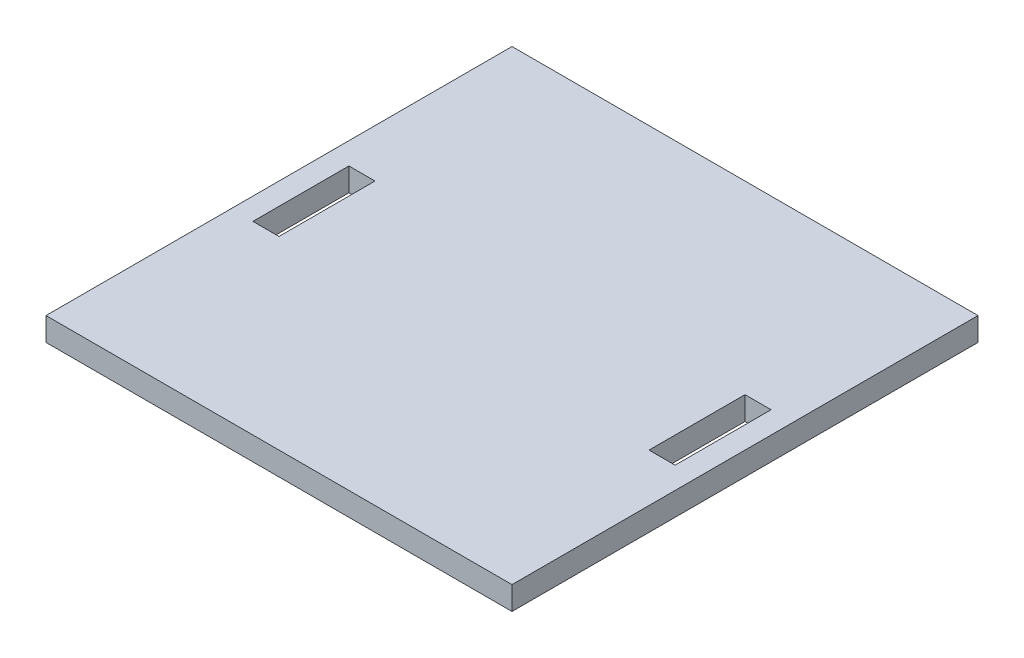
ISO-10303-21;
HEADER;
FILE_DESCRIPTION(('STEP AP214'),'2;1');
FILE_NAME('part.step','',(''),(''),'','','');
FILE_SCHEMA(('AUTOMOTIVE_DESIGN { 1 0 10303 214 1 1 1 1 }'));
ENDSEC;
DATA;
#1=APPLICATION_CONTEXT('core data for automotive mechanical design processes');
#2=APPLICATION_PROTOCOL_DEFINITION('international standard','automotive_design',2000,#1);
#3=PRODUCT_CONTEXT('',#1,'mechanical');
#4=PRODUCT('Part','Part','',(#3));
#5=PRODUCT_RELATED_PRODUCT_CATEGORY('part','',(#4));
#6=PRODUCT_DEFINITION_FORMATION('','',#4);
#7=PRODUCT_DEFINITION_CONTEXT('part definition',#1,'design');
#8=PRODUCT_DEFINITION('design','',#6,#7);
#9=PRODUCT_DEFINITION_SHAPE('','',#8);
#10=(LENGTH_UNIT() NAMED_UNIT(*) SI_UNIT(.MILLI.,.METRE.));
#11=(NAMED_UNIT(*) PLANE_ANGLE_UNIT() SI_UNIT($,.RADIAN.));
#12=(NAMED_UNIT(*) SI_UNIT($,.STERADIAN.) SOLID_ANGLE_UNIT());
#13=UNCERTAINTY_MEASURE_WITH_UNIT(LENGTH_MEASURE(1.E-05),#10,'distance_accuracy_value','');
#14=(GEOMETRIC_REPRESENTATION_CONTEXT(3) GLOBAL_UNCERTAINTY_ASSIGNED_CONTEXT((#13)) GLOBAL_UNIT_ASSIGNED_CONTEXT((#10,
#11,#12)) REPRESENTATION_CONTEXT('',''));
#15=CARTESIAN_POINT('',(0.,0.,0.));
#16=DIRECTION('',(0.,0.,1.));
#17=DIRECTION('',(1.,0.,0.));
#18=AXIS2_PLACEMENT_3D('',#15,#16,#17);
#19=CARTESIAN_POINT('',(0.,5.,0.));
#20=DIRECTION('',(0.,1.,0.));
#21=DIRECTION('',(0.,0.,1.));
#22=AXIS2_PLACEMENT_3D('',#19,#20,#21);
#23=PLANE('',#22);
#24=DIRECTION('',(0.,0.,1.));
#25=VECTOR('',#24,1.);
#26=CARTESIAN_POINT('',(0.,5.,0.));
#27=LINE('',#26,#25);
#28=CARTESIAN_POINT('',(0.,5.,0.));
#29=VERTEX_POINT('',#28);
#30=CARTESIAN_POINT('',(0.,5.,100.));
#31=VERTEX_POINT('',#30);
#32=EDGE_CURVE('E214',#29,#31,#27,.T.);
#33=ORIENTED_EDGE('',*,*,#32,.T.);
#34=DIRECTION('',(1.,0.,0.));
#35=VECTOR('',#34,1.);
#36=CARTESIAN_POINT('',(0.,5.,100.));
#37=LINE('',#36,#35);
#38=CARTESIAN_POINT('',(100.,5.,100.));
#39=VERTEX_POINT('',#38);
#40=EDGE_CURVE('E219',#31,#39,#37,.T.);
#41=ORIENTED_EDGE('',*,*,#40,.T.);
#42=DIRECTION('',(0.,0.,-1.));
#43=VECTOR('',#42,1.);
#44=CARTESIAN_POINT('',(100.,5.,0.));
#45=LINE('',#44,#43);
#46=CARTESIAN_POINT('',(100.,5.,0.));
#47=VERTEX_POINT('',#46);
#48=EDGE_CURVE('E227',#39,#47,#45,.T.);
#49=ORIENTED_EDGE('',*,*,#48,.T.);
#50=DIRECTION('',(-1.,0.,0.));
#51=VECTOR('',#50,1.);
#52=CARTESIAN_POINT('',(0.,5.,0.));
#53=LINE('',#52,#51);
#54=EDGE_CURVE('E230',#47,#29,#53,.T.);
#55=ORIENTED_EDGE('',*,*,#54,.T.);
#56=EDGE_LOOP('',(#33,#41,#49,#55));
#57=FACE_BOUND('',#56,.T.);
#58=DIRECTION('',(0.,0.,1.));
#59=VECTOR('',#58,1.);
#60=CARTESIAN_POINT('',(4.70000000000001,5.,39.7));
#61=LINE('',#60,#59);
#62=CARTESIAN_POINT('',(4.70000000000001,5.,39.7));
#63=VERTEX_POINT('',#62);
#64=CARTESIAN_POINT('',(4.70000000000001,5.,60.3));
#65=VERTEX_POINT('',#64);
#66=EDGE_CURVE('E180',#63,#65,#61,.T.);
#67=ORIENTED_EDGE('',*,*,#66,.F.);
#68=DIRECTION('',(-1.,0.,0.));
#69=VECTOR('',#68,1.);
#70=CARTESIAN_POINT('',(4.70000000000001,5.,39.7));
#71=LINE('',#70,#69);
#72=CARTESIAN_POINT('',(10.3,5.,39.7));
#73=VERTEX_POINT('',#72);
#74=EDGE_CURVE('E176',#73,#63,#71,.T.);
#75=ORIENTED_EDGE('',*,*,#74,.F.);
#76=DIRECTION('',(0.,0.,-1.));
#77=VECTOR('',#76,1.);
#78=CARTESIAN_POINT('',(10.3,5.,39.7));
#79=LINE('',#78,#77);
#80=CARTESIAN_POINT('',(10.3,5.,60.3));
#81=VERTEX_POINT('',#80);
#82=EDGE_CURVE('E187',#81,#73,#79,.T.);
#83=ORIENTED_EDGE('',*,*,#82,.F.);
#84=DIRECTION('',(1.,0.,0.));
#85=VECTOR('',#84,1.);
#86=CARTESIAN_POINT('',(4.70000000000001,5.,60.3));
#87=LINE('',#86,#85);
#88=EDGE_CURVE('E192',#65,#81,#87,.T.);
#89=ORIENTED_EDGE('',*,*,#88,.F.);
#90=EDGE_LOOP('',(#67,#75,#83,#89));
#91=FACE_BOUND('',#90,.T.);
#92=DIRECTION('',(0.,0.,1.));
#93=VECTOR('',#92,1.);
#94=CARTESIAN_POINT('',(89.7,5.,39.7));
#95=LINE('',#94,#93);
#96=CARTESIAN_POINT('',(89.7,5.,39.7));
#97=VERTEX_POINT('',#96);
#98=CARTESIAN_POINT('',(89.7,5.,60.3));
#99=VERTEX_POINT('',#98);
#100=EDGE_CURVE('E136',#97,#99,#95,.T.);
#101=ORIENTED_EDGE('',*,*,#100,.F.);
#102=DIRECTION('',(-1.,0.,0.));
#103=VECTOR('',#102,1.);
#104=CARTESIAN_POINT('',(95.3,5.,39.7));
#105=LINE('',#104,#103);
#106=CARTESIAN_POINT('',(95.3,5.,39.7));
#107=VERTEX_POINT('',#106);
#108=EDGE_CURVE('E127',#107,#97,#105,.T.);
#109=ORIENTED_EDGE('',*,*,#108,.F.);
#110=DIRECTION('',(0.,0.,-1.));
#111=VECTOR('',#110,1.);
#112=CARTESIAN_POINT('',(95.3,5.,39.7));
#113=LINE('',#112,#111);
#114=CARTESIAN_POINT('',(95.3,5.,60.3));
#115=VERTEX_POINT('',#114);
#116=EDGE_CURVE('E153',#115,#107,#113,.T.);
#117=ORIENTED_EDGE('',*,*,#116,.F.);
#118=DIRECTION('',(1.,0.,0.));
#119=VECTOR('',#118,1.);
#120=CARTESIAN_POINT('',(95.3,5.,60.3));
#121=LINE('',#120,#119);
#122=EDGE_CURVE('E148',#99,#115,#121,.T.);
#123=ORIENTED_EDGE('',*,*,#122,.F.);
#124=EDGE_LOOP('',(#101,#109,#117,#123));
#125=FACE_BOUND('',#124,.T.);
#126=ADVANCED_FACE('F38',(#57,#91,#125),#23,.T.);
#127=CARTESIAN_POINT('',(0.,0.,0.));
#128=DIRECTION('',(0.,1.,0.));
#129=DIRECTION('',(0.,0.,1.));
#130=AXIS2_PLACEMENT_3D('',#127,#128,#129);
#131=PLANE('',#130);
#132=DIRECTION('',(-1.,0.,0.));
#133=VECTOR('',#132,1.);
#134=CARTESIAN_POINT('',(4.70000000000001,0.,39.7));
#135=LINE('',#134,#133);
#136=CARTESIAN_POINT('',(10.3,0.,39.7));
#137=VERTEX_POINT('',#136);
#138=CARTESIAN_POINT('',(4.70000000000001,0.,39.7));
#139=VERTEX_POINT('',#138);
#140=EDGE_CURVE('E144',#137,#139,#135,.T.);
#141=ORIENTED_EDGE('',*,*,#140,.T.);
#142=DIRECTION('',(0.,0.,1.));
#143=VECTOR('',#142,1.);
#144=CARTESIAN_POINT('',(4.70000000000001,0.,39.7));
#145=LINE('',#144,#143);
#146=CARTESIAN_POINT('',(4.70000000000001,0.,60.3));
#147=VERTEX_POINT('',#146);
#148=EDGE_CURVE('E196',#139,#147,#145,.T.);
#149=ORIENTED_EDGE('',*,*,#148,.T.);
#150=DIRECTION('',(1.,0.,0.));
#151=VECTOR('',#150,1.);
#152=CARTESIAN_POINT('',(4.70000000000001,0.,60.3));
#153=LINE('',#152,#151);
#154=CARTESIAN_POINT('',(10.3,0.,60.3));
#155=VERTEX_POINT('',#154);
#156=EDGE_CURVE('E199',#147,#155,#153,.T.);
#157=ORIENTED_EDGE('',*,*,#156,.T.);
#158=DIRECTION('',(0.,0.,-1.));
#159=VECTOR('',#158,1.);
#160=CARTESIAN_POINT('',(10.3,0.,39.7));
#161=LINE('',#160,#159);
#162=EDGE_CURVE('E181',#155,#137,#161,.T.);
#163=ORIENTED_EDGE('',*,*,#162,.T.);
#164=EDGE_LOOP('',(#141,#149,#157,#163));
#165=FACE_BOUND('',#164,.T.);
#166=DIRECTION('',(0.,0.,1.));
#167=VECTOR('',#166,1.);
#168=CARTESIAN_POINT('',(0.,0.,0.));
#169=LINE('',#168,#167);
#170=CARTESIAN_POINT('',(0.,0.,0.));
#171=VERTEX_POINT('',#170);
#172=CARTESIAN_POINT('',(0.,0.,100.));
#173=VERTEX_POINT('',#172);
#174=EDGE_CURVE('E213',#171,#173,#169,.T.);
#175=ORIENTED_EDGE('',*,*,#174,.F.);
#176=DIRECTION('',(-1.,0.,0.));
#177=VECTOR('',#176,1.);
#178=CARTESIAN_POINT('',(0.,0.,0.));
#179=LINE('',#178,#177);
#180=CARTESIAN_POINT('',(100.,0.,0.));
#181=VERTEX_POINT('',#180);
#182=EDGE_CURVE('E220',#181,#171,#179,.T.);
#183=ORIENTED_EDGE('',*,*,#182,.F.);
#184=DIRECTION('',(0.,0.,-1.));
#185=VECTOR('',#184,1.);
#186=CARTESIAN_POINT('',(100.,0.,0.));
#187=LINE('',#186,#185);
#188=CARTESIAN_POINT('',(100.,0.,100.));
#189=VERTEX_POINT('',#188);
#190=EDGE_CURVE('E239',#189,#181,#187,.T.);
#191=ORIENTED_EDGE('',*,*,#190,.F.);
#192=DIRECTION('',(1.,0.,0.));
#193=VECTOR('',#192,1.);
#194=CARTESIAN_POINT('',(0.,0.,100.));
#195=LINE('',#194,#193);
#196=EDGE_CURVE('E237',#173,#189,#195,.T.);
#197=ORIENTED_EDGE('',*,*,#196,.F.);
#198=EDGE_LOOP('',(#175,#183,#191,#197));
#199=FACE_BOUND('',#198,.T.);
#200=DIRECTION('',(-1.,0.,0.));
#201=VECTOR('',#200,1.);
#202=CARTESIAN_POINT('',(95.3,0.,39.7));
#203=LINE('',#202,#201);
#204=CARTESIAN_POINT('',(95.3,0.,39.7));
#205=VERTEX_POINT('',#204);
#206=CARTESIAN_POINT('',(89.7,0.,39.7));
#207=VERTEX_POINT('',#206);
#208=EDGE_CURVE('E61',#205,#207,#203,.T.);
#209=ORIENTED_EDGE('',*,*,#208,.T.);
#210=DIRECTION('',(0.,0.,1.));
#211=VECTOR('',#210,1.);
#212=CARTESIAN_POINT('',(89.7,0.,39.7));
#213=LINE('',#212,#211);
#214=CARTESIAN_POINT('',(89.7,0.,60.3));
#215=VERTEX_POINT('',#214);
#216=EDGE_CURVE('E143',#207,#215,#213,.T.);
#217=ORIENTED_EDGE('',*,*,#216,.T.);
#218=DIRECTION('',(1.,0.,0.));
#219=VECTOR('',#218,1.);
#220=CARTESIAN_POINT('',(95.3,0.,60.3));
#221=LINE('',#220,#219);
#222=CARTESIAN_POINT('',(95.3,0.,60.3));
#223=VERTEX_POINT('',#222);
#224=EDGE_CURVE('E168',#215,#223,#221,.T.);
#225=ORIENTED_EDGE('',*,*,#224,.T.);
#226=DIRECTION('',(0.,0.,-1.));
#227=VECTOR('',#226,1.);
#228=CARTESIAN_POINT('',(95.3,0.,39.7));
#229=LINE('',#228,#227);
#230=EDGE_CURVE('E137',#223,#205,#229,.T.);
#231=ORIENTED_EDGE('',*,*,#230,.T.);
#232=EDGE_LOOP('',(#209,#217,#225,#231));
#233=FACE_BOUND('',#232,.T.);
#234=ADVANCED_FACE('F257',(#165,#199,#233),#131,.F.);
#235=CARTESIAN_POINT('',(0.,5.,0.));
#236=DIRECTION('',(1.,0.,0.));
#237=DIRECTION('',(0.,0.,-1.));
#238=AXIS2_PLACEMENT_3D('',#235,#236,#237);
#239=PLANE('',#238);
#240=ORIENTED_EDGE('',*,*,#174,.T.);
#241=DIRECTION('',(0.,-1.,0.));
#242=VECTOR('',#241,1.);
#243=CARTESIAN_POINT('',(0.,5.,100.));
#244=LINE('',#243,#242);
#245=EDGE_CURVE('E12',#31,#173,#244,.T.);
#246=ORIENTED_EDGE('',*,*,#245,.F.);
#247=ORIENTED_EDGE('',*,*,#32,.F.);
#248=DIRECTION('',(0.,-1.,0.));
#249=VECTOR('',#248,1.);
#250=CARTESIAN_POINT('',(0.,5.,0.));
#251=LINE('',#250,#249);
#252=EDGE_CURVE('E234',#29,#171,#251,.T.);
#253=ORIENTED_EDGE('',*,*,#252,.T.);
#254=EDGE_LOOP('',(#240,#246,#247,#253));
#255=FACE_BOUND('',#254,.T.);
#256=ADVANCED_FACE('F40',(#255),#239,.F.);
#257=CARTESIAN_POINT('',(0.,5.,100.));
#258=DIRECTION('',(0.,0.,-1.));
#259=DIRECTION('',(-1.,0.,0.));
#260=AXIS2_PLACEMENT_3D('',#257,#258,#259);
#261=PLANE('',#260);
#262=ORIENTED_EDGE('',*,*,#196,.T.);
#263=DIRECTION('',(0.,-1.,0.));
#264=VECTOR('',#263,1.);
#265=CARTESIAN_POINT('',(100.,5.,100.));
#266=LINE('',#265,#264);
#267=EDGE_CURVE('E46',#39,#189,#266,.T.);
#268=ORIENTED_EDGE('',*,*,#267,.F.);
#269=ORIENTED_EDGE('',*,*,#40,.F.);
#270=ORIENTED_EDGE('',*,*,#245,.T.);
#271=EDGE_LOOP('',(#262,#268,#269,#270));
#272=FACE_BOUND('',#271,.T.);
#273=ADVANCED_FACE('F307',(#272),#261,.F.);
#274=CARTESIAN_POINT('',(100.,5.,0.));
#275=DIRECTION('',(-1.,0.,0.));
#276=DIRECTION('',(0.,0.,1.));
#277=AXIS2_PLACEMENT_3D('',#274,#275,#276);
#278=PLANE('',#277);
#279=ORIENTED_EDGE('',*,*,#190,.T.);
#280=DIRECTION('',(0.,-1.,0.));
#281=VECTOR('',#280,1.);
#282=CARTESIAN_POINT('',(100.,5.,0.));
#283=LINE('',#282,#281);
#284=EDGE_CURVE('E244',#47,#181,#283,.T.);
#285=ORIENTED_EDGE('',*,*,#284,.F.);
#286=ORIENTED_EDGE('',*,*,#48,.F.);
#287=ORIENTED_EDGE('',*,*,#267,.T.);
#288=EDGE_LOOP('',(#279,#285,#286,#287));
#289=FACE_BOUND('',#288,.T.);
#290=ADVANCED_FACE('F251',(#289),#278,.F.);
#291=CARTESIAN_POINT('',(0.,5.,0.));
#292=DIRECTION('',(0.,0.,1.));
#293=DIRECTION('',(1.,0.,0.));
#294=AXIS2_PLACEMENT_3D('',#291,#292,#293);
#295=PLANE('',#294);
#296=ORIENTED_EDGE('',*,*,#182,.T.);
#297=ORIENTED_EDGE('',*,*,#252,.F.);
#298=ORIENTED_EDGE('',*,*,#54,.F.);
#299=ORIENTED_EDGE('',*,*,#284,.T.);
#300=EDGE_LOOP('',(#296,#297,#298,#299));
#301=FACE_BOUND('',#300,.T.);
#302=ADVANCED_FACE('F261',(#301),#295,.F.);
#303=CARTESIAN_POINT('',(4.70000000000001,5.,39.7));
#304=DIRECTION('',(0.,0.,1.));
#305=DIRECTION('',(1.,0.,0.));
#306=AXIS2_PLACEMENT_3D('',#303,#304,#305);
#307=PLANE('',#306);
#308=ORIENTED_EDGE('',*,*,#140,.F.);
#309=DIRECTION('',(0.,-1.,0.));
#310=VECTOR('',#309,1.);
#311=CARTESIAN_POINT('',(10.3,5.,39.7));
#312=LINE('',#311,#310);
#313=EDGE_CURVE('E191',#73,#137,#312,.T.);
#314=ORIENTED_EDGE('',*,*,#313,.F.);
#315=ORIENTED_EDGE('',*,*,#74,.T.);
#316=DIRECTION('',(0.,-1.,0.));
#317=VECTOR('',#316,1.);
#318=CARTESIAN_POINT('',(4.70000000000001,5.,39.7));
#319=LINE('',#318,#317);
#320=EDGE_CURVE('E210',#63,#139,#319,.T.);
#321=ORIENTED_EDGE('',*,*,#320,.T.);
#322=EDGE_LOOP('',(#308,#314,#315,#321));
#323=FACE_BOUND('',#322,.T.);
#324=ADVANCED_FACE('F284',(#323),#307,.T.);
#325=CARTESIAN_POINT('',(4.70000000000001,5.,39.7));
#326=DIRECTION('',(1.,0.,0.));
#327=DIRECTION('',(0.,0.,-1.));
#328=AXIS2_PLACEMENT_3D('',#325,#326,#327);
#329=PLANE('',#328);
#330=ORIENTED_EDGE('',*,*,#148,.F.);
#331=ORIENTED_EDGE('',*,*,#320,.F.);
#332=ORIENTED_EDGE('',*,*,#66,.T.);
#333=DIRECTION('',(0.,-1.,0.));
#334=VECTOR('',#333,1.);
#335=CARTESIAN_POINT('',(4.70000000000001,5.,60.3));
#336=LINE('',#335,#334);
#337=EDGE_CURVE('E208',#65,#147,#336,.T.);
#338=ORIENTED_EDGE('',*,*,#337,.T.);
#339=EDGE_LOOP('',(#330,#331,#332,#338));
#340=FACE_BOUND('',#339,.T.);
#341=ADVANCED_FACE('F288',(#340),#329,.T.);
#342=CARTESIAN_POINT('',(4.70000000000001,5.,60.3));
#343=DIRECTION('',(0.,0.,-1.));
#344=DIRECTION('',(-1.,0.,0.));
#345=AXIS2_PLACEMENT_3D('',#342,#343,#344);
#346=PLANE('',#345);
#347=ORIENTED_EDGE('',*,*,#156,.F.);
#348=ORIENTED_EDGE('',*,*,#337,.F.);
#349=ORIENTED_EDGE('',*,*,#88,.T.);
#350=DIRECTION('',(0.,-1.,0.));
#351=VECTOR('',#350,1.);
#352=CARTESIAN_POINT('',(10.3,5.,60.3));
#353=LINE('',#352,#351);
#354=EDGE_CURVE('E206',#81,#155,#353,.T.);
#355=ORIENTED_EDGE('',*,*,#354,.T.);
#356=EDGE_LOOP('',(#347,#348,#349,#355));
#357=FACE_BOUND('',#356,.T.);
#358=ADVANCED_FACE('F276',(#357),#346,.T.);
#359=CARTESIAN_POINT('',(10.3,5.,39.7));
#360=DIRECTION('',(-1.,0.,0.));
#361=DIRECTION('',(0.,0.,1.));
#362=AXIS2_PLACEMENT_3D('',#359,#360,#361);
#363=PLANE('',#362);
#364=ORIENTED_EDGE('',*,*,#162,.F.);
#365=ORIENTED_EDGE('',*,*,#354,.F.);
#366=ORIENTED_EDGE('',*,*,#82,.T.);
#367=ORIENTED_EDGE('',*,*,#313,.T.);
#368=EDGE_LOOP('',(#364,#365,#366,#367));
#369=FACE_BOUND('',#368,.T.);
#370=ADVANCED_FACE('F282',(#369),#363,.T.);
#371=CARTESIAN_POINT('',(95.3,5.,39.7));
#372=DIRECTION('',(0.,0.,1.));
#373=DIRECTION('',(1.,0.,0.));
#374=AXIS2_PLACEMENT_3D('',#371,#372,#373);
#375=PLANE('',#374);
#376=ORIENTED_EDGE('',*,*,#208,.F.);
#377=DIRECTION('',(0.,-1.,0.));
#378=VECTOR('',#377,1.);
#379=CARTESIAN_POINT('',(95.3,5.,39.7));
#380=LINE('',#379,#378);
#381=EDGE_CURVE('E131',#107,#205,#380,.T.);
#382=ORIENTED_EDGE('',*,*,#381,.F.);
#383=ORIENTED_EDGE('',*,*,#108,.T.);
#384=DIRECTION('',(0.,-1.,0.));
#385=VECTOR('',#384,1.);
#386=CARTESIAN_POINT('',(89.7,5.,39.7));
#387=LINE('',#386,#385);
#388=EDGE_CURVE('E130',#97,#207,#387,.T.);
#389=ORIENTED_EDGE('',*,*,#388,.T.);
#390=EDGE_LOOP('',(#376,#382,#383,#389));
#391=FACE_BOUND('',#390,.T.);
#392=ADVANCED_FACE('F129',(#391),#375,.T.);
#393=CARTESIAN_POINT('',(89.7,5.,39.7));
#394=DIRECTION('',(1.,0.,0.));
#395=DIRECTION('',(0.,0.,-1.));
#396=AXIS2_PLACEMENT_3D('',#393,#394,#395);
#397=PLANE('',#396);
#398=ORIENTED_EDGE('',*,*,#216,.F.);
#399=ORIENTED_EDGE('',*,*,#388,.F.);
#400=ORIENTED_EDGE('',*,*,#100,.T.);
#401=DIRECTION('',(0.,-1.,0.));
#402=VECTOR('',#401,1.);
#403=CARTESIAN_POINT('',(89.7,5.,60.3));
#404=LINE('',#403,#402);
#405=EDGE_CURVE('E145',#99,#215,#404,.T.);
#406=ORIENTED_EDGE('',*,*,#405,.T.);
#407=EDGE_LOOP('',(#398,#399,#400,#406));
#408=FACE_BOUND('',#407,.T.);
#409=ADVANCED_FACE('F140',(#408),#397,.T.);
#410=CARTESIAN_POINT('',(95.3,5.,60.3));
#411=DIRECTION('',(0.,0.,-1.));
#412=DIRECTION('',(-1.,0.,0.));
#413=AXIS2_PLACEMENT_3D('',#410,#411,#412);
#414=PLANE('',#413);
#415=ORIENTED_EDGE('',*,*,#224,.F.);
#416=ORIENTED_EDGE('',*,*,#405,.F.);
#417=ORIENTED_EDGE('',*,*,#122,.T.);
#418=DIRECTION('',(0.,-1.,0.));
#419=VECTOR('',#418,1.);
#420=CARTESIAN_POINT('',(95.3,5.,60.3));
#421=LINE('',#420,#419);
#422=EDGE_CURVE('E53',#115,#223,#421,.T.);
#423=ORIENTED_EDGE('',*,*,#422,.T.);
#424=EDGE_LOOP('',(#415,#416,#417,#423));
#425=FACE_BOUND('',#424,.T.);
#426=ADVANCED_FACE('F376',(#425),#414,.T.);
#427=CARTESIAN_POINT('',(95.3,5.,39.7));
#428=DIRECTION('',(-1.,0.,0.));
#429=DIRECTION('',(0.,0.,1.));
#430=AXIS2_PLACEMENT_3D('',#427,#428,#429);
#431=PLANE('',#430);
#432=ORIENTED_EDGE('',*,*,#230,.F.);
#433=ORIENTED_EDGE('',*,*,#422,.F.);
#434=ORIENTED_EDGE('',*,*,#116,.T.);
#435=ORIENTED_EDGE('',*,*,#381,.T.);
#436=EDGE_LOOP('',(#432,#433,#434,#435));
#437=FACE_BOUND('',#436,.T.);
#438=ADVANCED_FACE('F384',(#437),#431,.T.);
#439=CLOSED_SHELL('',(#126,#234,#256,#273,#290,#302,#324,#341,#358,#370,#392,#409,#426,#438));
#440=MANIFOLD_SOLID_BREP('B2',#439);
#441=ADVANCED_BREP_SHAPE_REPRESENTATION('',(#18,#440),#14);
#442=SHAPE_DEFINITION_REPRESENTATION(#9,#441);
ENDSEC;
END-ISO-10303-21;
